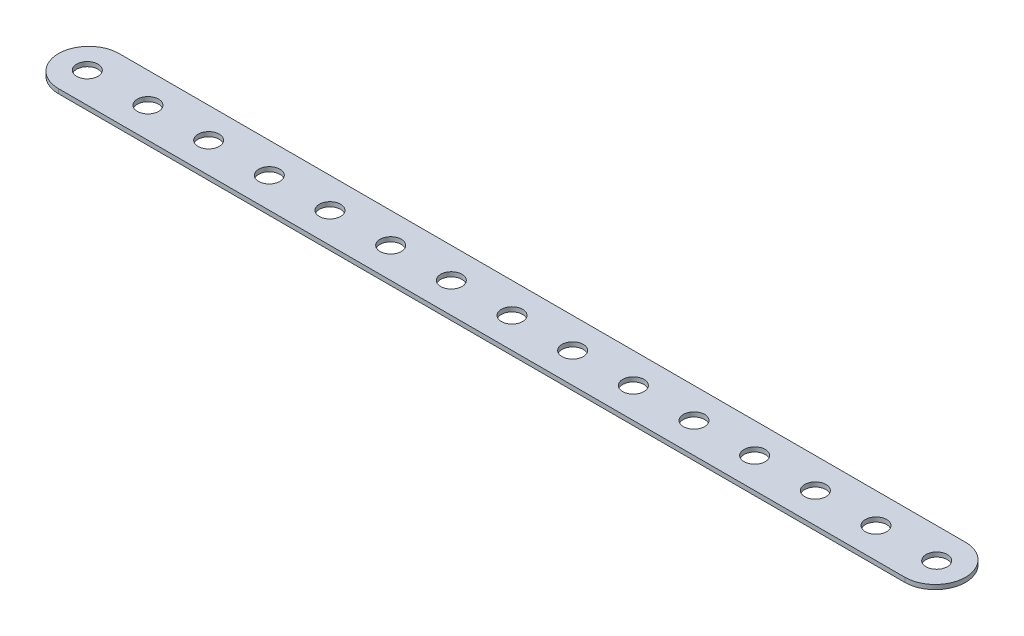
ISO-10303-21;
HEADER;
FILE_DESCRIPTION(('STEP AP214'),'2;1');
FILE_NAME('part.step','',(''),(''),'','','');
FILE_SCHEMA(('AUTOMOTIVE_DESIGN { 1 0 10303 214 1 1 1 1 }'));
ENDSEC;
DATA;
#1=APPLICATION_CONTEXT('core data for automotive mechanical design processes');
#2=APPLICATION_PROTOCOL_DEFINITION('international standard','automotive_design',2000,#1);
#3=PRODUCT_CONTEXT('',#1,'mechanical');
#4=PRODUCT('Part','Part','',(#3));
#5=PRODUCT_RELATED_PRODUCT_CATEGORY('part','',(#4));
#6=PRODUCT_DEFINITION_FORMATION('','',#4);
#7=PRODUCT_DEFINITION_CONTEXT('part definition',#1,'design');
#8=PRODUCT_DEFINITION('design','',#6,#7);
#9=PRODUCT_DEFINITION_SHAPE('','',#8);
#10=(LENGTH_UNIT() NAMED_UNIT(*) SI_UNIT(.MILLI.,.METRE.));
#11=(NAMED_UNIT(*) PLANE_ANGLE_UNIT() SI_UNIT($,.RADIAN.));
#12=(NAMED_UNIT(*) SI_UNIT($,.STERADIAN.) SOLID_ANGLE_UNIT());
#13=UNCERTAINTY_MEASURE_WITH_UNIT(LENGTH_MEASURE(1.E-05),#10,'distance_accuracy_value','');
#14=(GEOMETRIC_REPRESENTATION_CONTEXT(3) GLOBAL_UNCERTAINTY_ASSIGNED_CONTEXT((#13)) GLOBAL_UNIT_ASSIGNED_CONTEXT((#10,
#11,#12)) REPRESENTATION_CONTEXT('',''));
#15=CARTESIAN_POINT('',(0.,0.,0.));
#16=DIRECTION('',(0.,0.,1.));
#17=DIRECTION('',(1.,0.,0.));
#18=AXIS2_PLACEMENT_3D('',#15,#16,#17);
#19=CARTESIAN_POINT('',(0.,0.9398,6.35));
#20=DIRECTION('',(0.,0.,-1.));
#21=DIRECTION('',(-1.,0.,0.));
#22=AXIS2_PLACEMENT_3D('',#19,#20,#21);
#23=PLANE('',#22);
#24=DIRECTION('',(1.,0.,0.));
#25=VECTOR('',#24,1.);
#26=CARTESIAN_POINT('',(0.,0.,6.35));
#27=LINE('',#26,#25);
#28=CARTESIAN_POINT('',(-177.165,0.,6.35));
#29=VERTEX_POINT('',#28);
#30=CARTESIAN_POINT('',(0.,0.,6.35));
#31=VERTEX_POINT('',#30);
#32=EDGE_CURVE('E108',#29,#31,#27,.T.);
#33=ORIENTED_EDGE('',*,*,#32,.T.);
#34=DIRECTION('',(0.,-1.,0.));
#35=VECTOR('',#34,1.);
#36=CARTESIAN_POINT('',(0.,0.9398,6.35));
#37=LINE('',#36,#35);
#38=CARTESIAN_POINT('',(0.,0.9398,6.35));
#39=VERTEX_POINT('',#38);
#40=EDGE_CURVE('E92',#39,#31,#37,.T.);
#41=ORIENTED_EDGE('',*,*,#40,.F.);
#42=DIRECTION('',(1.,0.,0.));
#43=VECTOR('',#42,1.);
#44=CARTESIAN_POINT('',(0.,0.9398,6.35));
#45=LINE('',#44,#43);
#46=CARTESIAN_POINT('',(-177.165,0.9398,6.35));
#47=VERTEX_POINT('',#46);
#48=EDGE_CURVE('E86',#47,#39,#45,.T.);
#49=ORIENTED_EDGE('',*,*,#48,.F.);
#50=DIRECTION('',(0.,-1.,0.));
#51=VECTOR('',#50,1.);
#52=CARTESIAN_POINT('',(-177.165,0.9398,6.35));
#53=LINE('',#52,#51);
#54=EDGE_CURVE('E97',#47,#29,#53,.T.);
#55=ORIENTED_EDGE('',*,*,#54,.T.);
#56=EDGE_LOOP('',(#33,#41,#49,#55));
#57=FACE_BOUND('',#56,.T.);
#58=ADVANCED_FACE('F32',(#57),#23,.F.);
#59=CARTESIAN_POINT('',(0.,0.9398,0.));
#60=DIRECTION('',(0.,-1.,0.));
#61=DIRECTION('',(0.,0.,-1.));
#62=AXIS2_PLACEMENT_3D('',#59,#60,#61);
#63=CYLINDRICAL_SURFACE('',#62,6.35);
#64=CARTESIAN_POINT('',(0.,0.,0.));
#65=DIRECTION('',(0.,1.,0.));
#66=DIRECTION('',(0.,0.,1.));
#67=AXIS2_PLACEMENT_3D('',#64,#65,#66);
#68=CIRCLE('',#67,6.35);
#69=CARTESIAN_POINT('',(0.,0.,-6.35));
#70=VERTEX_POINT('',#69);
#71=EDGE_CURVE('E91',#31,#70,#68,.T.);
#72=ORIENTED_EDGE('',*,*,#71,.T.);
#73=DIRECTION('',(0.,-1.,0.));
#74=VECTOR('',#73,1.);
#75=CARTESIAN_POINT('',(0.,0.9398,-6.35));
#76=LINE('',#75,#74);
#77=CARTESIAN_POINT('',(0.,0.9398,-6.35));
#78=VERTEX_POINT('',#77);
#79=EDGE_CURVE('E89',#78,#70,#76,.T.);
#80=ORIENTED_EDGE('',*,*,#79,.F.);
#81=CARTESIAN_POINT('',(0.,0.9398,0.));
#82=DIRECTION('',(0.,1.,0.));
#83=DIRECTION('',(0.,0.,1.));
#84=AXIS2_PLACEMENT_3D('',#81,#82,#83);
#85=CIRCLE('',#84,6.35);
#86=EDGE_CURVE('E80',#39,#78,#85,.T.);
#87=ORIENTED_EDGE('',*,*,#86,.F.);
#88=ORIENTED_EDGE('',*,*,#40,.T.);
#89=EDGE_LOOP('',(#72,#80,#87,#88));
#90=FACE_BOUND('',#89,.T.);
#91=ADVANCED_FACE('F90',(#90),#63,.T.);
#92=CARTESIAN_POINT('',(0.,0.9398,-6.35));
#93=DIRECTION('',(0.,0.,1.));
#94=DIRECTION('',(1.,0.,0.));
#95=AXIS2_PLACEMENT_3D('',#92,#93,#94);
#96=PLANE('',#95);
#97=DIRECTION('',(-1.,0.,0.));
#98=VECTOR('',#97,1.);
#99=CARTESIAN_POINT('',(0.,0.,-6.35));
#100=LINE('',#99,#98);
#101=CARTESIAN_POINT('',(-177.165,0.,-6.35));
#102=VERTEX_POINT('',#101);
#103=EDGE_CURVE('E66',#70,#102,#100,.T.);
#104=ORIENTED_EDGE('',*,*,#103,.T.);
#105=DIRECTION('',(0.,-1.,0.));
#106=VECTOR('',#105,1.);
#107=CARTESIAN_POINT('',(-177.165,0.9398,-6.35));
#108=LINE('',#107,#106);
#109=CARTESIAN_POINT('',(-177.165,0.9398,-6.35));
#110=VERTEX_POINT('',#109);
#111=EDGE_CURVE('E93',#110,#102,#108,.T.);
#112=ORIENTED_EDGE('',*,*,#111,.F.);
#113=DIRECTION('',(-1.,0.,0.));
#114=VECTOR('',#113,1.);
#115=CARTESIAN_POINT('',(0.,0.9398,-6.35));
#116=LINE('',#115,#114);
#117=EDGE_CURVE('E84',#78,#110,#116,.T.);
#118=ORIENTED_EDGE('',*,*,#117,.F.);
#119=ORIENTED_EDGE('',*,*,#79,.T.);
#120=EDGE_LOOP('',(#104,#112,#118,#119));
#121=FACE_BOUND('',#120,.T.);
#122=ADVANCED_FACE('F95',(#121),#96,.F.);
#123=CARTESIAN_POINT('',(0.317500000000001,0.9398,0.));
#124=DIRECTION('',(0.,-1.,0.));
#125=DIRECTION('',(0.,0.,-1.));
#126=AXIS2_PLACEMENT_3D('',#123,#124,#125);
#127=CYLINDRICAL_SURFACE('',#126,2.2225);
#128=CARTESIAN_POINT('',(0.317500000000001,0.9398,0.));
#129=DIRECTION('',(0.,1.,0.));
#130=DIRECTION('',(0.,0.,1.));
#131=AXIS2_PLACEMENT_3D('',#128,#129,#130);
#132=CIRCLE('',#131,2.2225);
#133=CARTESIAN_POINT('',(0.317500000000001,0.9398,2.2225));
#134=VERTEX_POINT('',#133);
#135=EDGE_CURVE('E405',#134,#134,#132,.T.);
#136=ORIENTED_EDGE('',*,*,#135,.T.);
#137=EDGE_LOOP('',(#136));
#138=FACE_BOUND('',#137,.T.);
#139=CARTESIAN_POINT('',(0.317500000000001,0.,0.));
#140=DIRECTION('',(0.,1.,0.));
#141=DIRECTION('',(0.,0.,1.));
#142=AXIS2_PLACEMENT_3D('',#139,#140,#141);
#143=CIRCLE('',#142,2.2225);
#144=CARTESIAN_POINT('',(0.317500000000001,0.,2.2225));
#145=VERTEX_POINT('',#144);
#146=EDGE_CURVE('E104',#145,#145,#143,.T.);
#147=ORIENTED_EDGE('',*,*,#146,.F.);
#148=EDGE_LOOP('',(#147));
#149=FACE_BOUND('',#148,.T.);
#150=ADVANCED_FACE('F212',(#138,#149),#127,.F.);
#151=CARTESIAN_POINT('',(-177.4825,0.9398,0.));
#152=DIRECTION('',(0.,-1.,0.));
#153=DIRECTION('',(0.,0.,-1.));
#154=AXIS2_PLACEMENT_3D('',#151,#152,#153);
#155=CYLINDRICAL_SURFACE('',#154,2.22249999999999);
#156=CARTESIAN_POINT('',(-177.4825,0.9398,0.));
#157=DIRECTION('',(0.,1.,0.));
#158=DIRECTION('',(0.,0.,1.));
#159=AXIS2_PLACEMENT_3D('',#156,#157,#158);
#160=CIRCLE('',#159,2.22249999999999);
#161=CARTESIAN_POINT('',(-177.4825,0.9398,2.22249999999999));
#162=VERTEX_POINT('',#161);
#163=EDGE_CURVE('E114',#162,#162,#160,.T.);
#164=ORIENTED_EDGE('',*,*,#163,.T.);
#165=EDGE_LOOP('',(#164));
#166=FACE_BOUND('',#165,.T.);
#167=CARTESIAN_POINT('',(-177.4825,0.,0.));
#168=DIRECTION('',(0.,1.,0.));
#169=DIRECTION('',(0.,0.,1.));
#170=AXIS2_PLACEMENT_3D('',#167,#168,#169);
#171=CIRCLE('',#170,2.22249999999999);
#172=CARTESIAN_POINT('',(-177.4825,0.,2.22249999999999));
#173=VERTEX_POINT('',#172);
#174=EDGE_CURVE('E101',#173,#173,#171,.T.);
#175=ORIENTED_EDGE('',*,*,#174,.F.);
#176=EDGE_LOOP('',(#175));
#177=FACE_BOUND('',#176,.T.);
#178=ADVANCED_FACE('F198',(#166,#177),#155,.F.);
#179=CARTESIAN_POINT('',(-177.165,0.9398,0.));
#180=DIRECTION('',(0.,-1.,0.));
#181=DIRECTION('',(0.,0.,-1.));
#182=AXIS2_PLACEMENT_3D('',#179,#180,#181);
#183=CYLINDRICAL_SURFACE('',#182,6.35);
#184=CARTESIAN_POINT('',(-177.165,0.,0.));
#185=DIRECTION('',(0.,1.,0.));
#186=DIRECTION('',(0.,0.,1.));
#187=AXIS2_PLACEMENT_3D('',#184,#185,#186);
#188=CIRCLE('',#187,6.35);
#189=EDGE_CURVE('E72',#102,#29,#188,.T.);
#190=ORIENTED_EDGE('',*,*,#189,.T.);
#191=ORIENTED_EDGE('',*,*,#54,.F.);
#192=CARTESIAN_POINT('',(-177.165,0.9398,0.));
#193=DIRECTION('',(0.,1.,0.));
#194=DIRECTION('',(0.,0.,1.));
#195=AXIS2_PLACEMENT_3D('',#192,#193,#194);
#196=CIRCLE('',#195,6.35);
#197=EDGE_CURVE('E49',#110,#47,#196,.T.);
#198=ORIENTED_EDGE('',*,*,#197,.F.);
#199=ORIENTED_EDGE('',*,*,#111,.T.);
#200=EDGE_LOOP('',(#190,#191,#198,#199));
#201=FACE_BOUND('',#200,.T.);
#202=ADVANCED_FACE('F188',(#201),#183,.T.);
#203=CARTESIAN_POINT('',(0.,0.9398,0.));
#204=DIRECTION('',(0.,1.,0.));
#205=DIRECTION('',(0.,0.,1.));
#206=AXIS2_PLACEMENT_3D('',#203,#204,#205);
#207=PLANE('',#206);
#208=CARTESIAN_POINT('',(-152.0825,0.9398,0.));
#209=DIRECTION('',(0.,1.,0.));
#210=DIRECTION('',(0.,0.,1.));
#211=AXIS2_PLACEMENT_3D('',#208,#209,#210);
#212=CIRCLE('',#211,2.22249999999999);
#213=CARTESIAN_POINT('',(-152.0825,0.9398,2.22249999999999));
#214=VERTEX_POINT('',#213);
#215=EDGE_CURVE('E396',#214,#214,#212,.T.);
#216=ORIENTED_EDGE('',*,*,#215,.F.);
#217=EDGE_LOOP('',(#216));
#218=FACE_BOUND('',#217,.T.);
#219=CARTESIAN_POINT('',(-164.7825,0.9398,0.));
#220=DIRECTION('',(0.,1.,0.));
#221=DIRECTION('',(0.,0.,1.));
#222=AXIS2_PLACEMENT_3D('',#219,#220,#221);
#223=CIRCLE('',#222,2.22249999999999);
#224=CARTESIAN_POINT('',(-164.7825,0.9398,2.22249999999999));
#225=VERTEX_POINT('',#224);
#226=EDGE_CURVE('E395',#225,#225,#223,.T.);
#227=ORIENTED_EDGE('',*,*,#226,.F.);
#228=EDGE_LOOP('',(#227));
#229=FACE_BOUND('',#228,.T.);
#230=ORIENTED_EDGE('',*,*,#163,.F.);
#231=EDGE_LOOP('',(#230));
#232=FACE_BOUND('',#231,.T.);
#233=ORIENTED_EDGE('',*,*,#135,.F.);
#234=EDGE_LOOP('',(#233));
#235=FACE_BOUND('',#234,.T.);
#236=ORIENTED_EDGE('',*,*,#48,.T.);
#237=ORIENTED_EDGE('',*,*,#86,.T.);
#238=ORIENTED_EDGE('',*,*,#117,.T.);
#239=ORIENTED_EDGE('',*,*,#197,.T.);
#240=EDGE_LOOP('',(#236,#237,#238,#239));
#241=FACE_BOUND('',#240,.T.);
#242=CARTESIAN_POINT('',(-139.3825,0.9398,0.));
#243=DIRECTION('',(0.,1.,0.));
#244=DIRECTION('',(0.,0.,1.));
#245=AXIS2_PLACEMENT_3D('',#242,#243,#244);
#246=CIRCLE('',#245,2.22249999999999);
#247=CARTESIAN_POINT('',(-139.3825,0.9398,2.22249999999999));
#248=VERTEX_POINT('',#247);
#249=EDGE_CURVE('E121',#248,#248,#246,.T.);
#250=ORIENTED_EDGE('',*,*,#249,.F.);
#251=EDGE_LOOP('',(#250));
#252=FACE_BOUND('',#251,.T.);
#253=CARTESIAN_POINT('',(-126.6825,0.9398,0.));
#254=DIRECTION('',(0.,1.,0.));
#255=DIRECTION('',(0.,0.,1.));
#256=AXIS2_PLACEMENT_3D('',#253,#254,#255);
#257=CIRCLE('',#256,2.22249999999999);
#258=CARTESIAN_POINT('',(-126.6825,0.9398,2.22249999999999));
#259=VERTEX_POINT('',#258);
#260=EDGE_CURVE('E127',#259,#259,#257,.T.);
#261=ORIENTED_EDGE('',*,*,#260,.F.);
#262=EDGE_LOOP('',(#261));
#263=FACE_BOUND('',#262,.T.);
#264=CARTESIAN_POINT('',(-113.9825,0.9398,0.));
#265=DIRECTION('',(0.,1.,0.));
#266=DIRECTION('',(0.,0.,1.));
#267=AXIS2_PLACEMENT_3D('',#264,#265,#266);
#268=CIRCLE('',#267,2.22249999999999);
#269=CARTESIAN_POINT('',(-113.9825,0.9398,2.22249999999999));
#270=VERTEX_POINT('',#269);
#271=EDGE_CURVE('E133',#270,#270,#268,.T.);
#272=ORIENTED_EDGE('',*,*,#271,.F.);
#273=EDGE_LOOP('',(#272));
#274=FACE_BOUND('',#273,.T.);
#275=CARTESIAN_POINT('',(-101.2825,0.9398,0.));
#276=DIRECTION('',(0.,1.,0.));
#277=DIRECTION('',(0.,0.,1.));
#278=AXIS2_PLACEMENT_3D('',#275,#276,#277);
#279=CIRCLE('',#278,2.22249999999999);
#280=CARTESIAN_POINT('',(-101.2825,0.9398,2.22249999999999));
#281=VERTEX_POINT('',#280);
#282=EDGE_CURVE('E139',#281,#281,#279,.T.);
#283=ORIENTED_EDGE('',*,*,#282,.F.);
#284=EDGE_LOOP('',(#283));
#285=FACE_BOUND('',#284,.T.);
#286=CARTESIAN_POINT('',(-88.5825,0.9398,0.));
#287=DIRECTION('',(0.,1.,0.));
#288=DIRECTION('',(0.,0.,1.));
#289=AXIS2_PLACEMENT_3D('',#286,#287,#288);
#290=CIRCLE('',#289,2.22249999999999);
#291=CARTESIAN_POINT('',(-88.5825,0.9398,2.22249999999999));
#292=VERTEX_POINT('',#291);
#293=EDGE_CURVE('E145',#292,#292,#290,.T.);
#294=ORIENTED_EDGE('',*,*,#293,.F.);
#295=EDGE_LOOP('',(#294));
#296=FACE_BOUND('',#295,.T.);
#297=CARTESIAN_POINT('',(-75.8825,0.9398,0.));
#298=DIRECTION('',(0.,1.,0.));
#299=DIRECTION('',(0.,0.,1.));
#300=AXIS2_PLACEMENT_3D('',#297,#298,#299);
#301=CIRCLE('',#300,2.22249999999999);
#302=CARTESIAN_POINT('',(-75.8825,0.9398,2.22249999999999));
#303=VERTEX_POINT('',#302);
#304=EDGE_CURVE('E151',#303,#303,#301,.T.);
#305=ORIENTED_EDGE('',*,*,#304,.F.);
#306=EDGE_LOOP('',(#305));
#307=FACE_BOUND('',#306,.T.);
#308=CARTESIAN_POINT('',(-63.1825,0.9398,0.));
#309=DIRECTION('',(0.,1.,0.));
#310=DIRECTION('',(0.,0.,1.));
#311=AXIS2_PLACEMENT_3D('',#308,#309,#310);
#312=CIRCLE('',#311,2.22249999999999);
#313=CARTESIAN_POINT('',(-63.1825,0.9398,2.22249999999999));
#314=VERTEX_POINT('',#313);
#315=EDGE_CURVE('E157',#314,#314,#312,.T.);
#316=ORIENTED_EDGE('',*,*,#315,.F.);
#317=EDGE_LOOP('',(#316));
#318=FACE_BOUND('',#317,.T.);
#319=CARTESIAN_POINT('',(-50.4825,0.9398,0.));
#320=DIRECTION('',(0.,1.,0.));
#321=DIRECTION('',(0.,0.,1.));
#322=AXIS2_PLACEMENT_3D('',#319,#320,#321);
#323=CIRCLE('',#322,2.22249999999999);
#324=CARTESIAN_POINT('',(-50.4825,0.9398,2.22249999999999));
#325=VERTEX_POINT('',#324);
#326=EDGE_CURVE('E163',#325,#325,#323,.T.);
#327=ORIENTED_EDGE('',*,*,#326,.F.);
#328=EDGE_LOOP('',(#327));
#329=FACE_BOUND('',#328,.T.);
#330=CARTESIAN_POINT('',(-37.7825,0.9398,0.));
#331=DIRECTION('',(0.,1.,0.));
#332=DIRECTION('',(0.,0.,1.));
#333=AXIS2_PLACEMENT_3D('',#330,#331,#332);
#334=CIRCLE('',#333,2.22249999999999);
#335=CARTESIAN_POINT('',(-37.7825,0.9398,2.22249999999999));
#336=VERTEX_POINT('',#335);
#337=EDGE_CURVE('E169',#336,#336,#334,.T.);
#338=ORIENTED_EDGE('',*,*,#337,.F.);
#339=EDGE_LOOP('',(#338));
#340=FACE_BOUND('',#339,.T.);
#341=CARTESIAN_POINT('',(-25.0825,0.9398,0.));
#342=DIRECTION('',(0.,1.,0.));
#343=DIRECTION('',(0.,0.,1.));
#344=AXIS2_PLACEMENT_3D('',#341,#342,#343);
#345=CIRCLE('',#344,2.22249999999999);
#346=CARTESIAN_POINT('',(-25.0825,0.9398,2.22249999999999));
#347=VERTEX_POINT('',#346);
#348=EDGE_CURVE('E175',#347,#347,#345,.T.);
#349=ORIENTED_EDGE('',*,*,#348,.F.);
#350=EDGE_LOOP('',(#349));
#351=FACE_BOUND('',#350,.T.);
#352=CARTESIAN_POINT('',(-12.3825,0.9398,0.));
#353=DIRECTION('',(0.,1.,0.));
#354=DIRECTION('',(0.,0.,1.));
#355=AXIS2_PLACEMENT_3D('',#352,#353,#354);
#356=CIRCLE('',#355,2.22249999999999);
#357=CARTESIAN_POINT('',(-12.3825,0.9398,2.22249999999999));
#358=VERTEX_POINT('',#357);
#359=EDGE_CURVE('E11',#358,#358,#356,.T.);
#360=ORIENTED_EDGE('',*,*,#359,.F.);
#361=EDGE_LOOP('',(#360));
#362=FACE_BOUND('',#361,.T.);
#363=ADVANCED_FACE('F81',(#218,#229,#232,#235,#241,#252,#263,#274,#285,#296,#307,#318,#329,#340,
#351,#362),#207,.T.);
#364=CARTESIAN_POINT('',(0.,0.,0.));
#365=DIRECTION('',(0.,1.,0.));
#366=DIRECTION('',(0.,0.,1.));
#367=AXIS2_PLACEMENT_3D('',#364,#365,#366);
#368=PLANE('',#367);
#369=CARTESIAN_POINT('',(-152.0825,0.,0.));
#370=DIRECTION('',(0.,1.,0.));
#371=DIRECTION('',(0.,0.,1.));
#372=AXIS2_PLACEMENT_3D('',#369,#370,#371);
#373=CIRCLE('',#372,2.22249999999999);
#374=CARTESIAN_POINT('',(-152.0825,0.,2.22249999999999));
#375=VERTEX_POINT('',#374);
#376=EDGE_CURVE('E400',#375,#375,#373,.T.);
#377=ORIENTED_EDGE('',*,*,#376,.T.);
#378=EDGE_LOOP('',(#377));
#379=FACE_BOUND('',#378,.T.);
#380=CARTESIAN_POINT('',(-164.7825,0.,0.));
#381=DIRECTION('',(0.,1.,0.));
#382=DIRECTION('',(0.,0.,1.));
#383=AXIS2_PLACEMENT_3D('',#380,#381,#382);
#384=CIRCLE('',#383,2.22249999999999);
#385=CARTESIAN_POINT('',(-164.7825,0.,2.22249999999999));
#386=VERTEX_POINT('',#385);
#387=EDGE_CURVE('E105',#386,#386,#384,.T.);
#388=ORIENTED_EDGE('',*,*,#387,.T.);
#389=EDGE_LOOP('',(#388));
#390=FACE_BOUND('',#389,.T.);
#391=ORIENTED_EDGE('',*,*,#174,.T.);
#392=EDGE_LOOP('',(#391));
#393=FACE_BOUND('',#392,.T.);
#394=ORIENTED_EDGE('',*,*,#146,.T.);
#395=EDGE_LOOP('',(#394));
#396=FACE_BOUND('',#395,.T.);
#397=ORIENTED_EDGE('',*,*,#32,.F.);
#398=ORIENTED_EDGE('',*,*,#189,.F.);
#399=ORIENTED_EDGE('',*,*,#103,.F.);
#400=ORIENTED_EDGE('',*,*,#71,.F.);
#401=EDGE_LOOP('',(#397,#398,#399,#400));
#402=FACE_BOUND('',#401,.T.);
#403=CARTESIAN_POINT('',(-139.3825,0.,0.));
#404=DIRECTION('',(0.,1.,0.));
#405=DIRECTION('',(0.,0.,1.));
#406=AXIS2_PLACEMENT_3D('',#403,#404,#405);
#407=CIRCLE('',#406,2.22249999999999);
#408=CARTESIAN_POINT('',(-139.3825,0.,2.22249999999999));
#409=VERTEX_POINT('',#408);
#410=EDGE_CURVE('E118',#409,#409,#407,.T.);
#411=ORIENTED_EDGE('',*,*,#410,.T.);
#412=EDGE_LOOP('',(#411));
#413=FACE_BOUND('',#412,.T.);
#414=CARTESIAN_POINT('',(-126.6825,0.,0.));
#415=DIRECTION('',(0.,1.,0.));
#416=DIRECTION('',(0.,0.,1.));
#417=AXIS2_PLACEMENT_3D('',#414,#415,#416);
#418=CIRCLE('',#417,2.22249999999999);
#419=CARTESIAN_POINT('',(-126.6825,0.,2.22249999999999));
#420=VERTEX_POINT('',#419);
#421=EDGE_CURVE('E124',#420,#420,#418,.T.);
#422=ORIENTED_EDGE('',*,*,#421,.T.);
#423=EDGE_LOOP('',(#422));
#424=FACE_BOUND('',#423,.T.);
#425=CARTESIAN_POINT('',(-113.9825,0.,0.));
#426=DIRECTION('',(0.,1.,0.));
#427=DIRECTION('',(0.,0.,1.));
#428=AXIS2_PLACEMENT_3D('',#425,#426,#427);
#429=CIRCLE('',#428,2.22249999999999);
#430=CARTESIAN_POINT('',(-113.9825,0.,2.22249999999999));
#431=VERTEX_POINT('',#430);
#432=EDGE_CURVE('E130',#431,#431,#429,.T.);
#433=ORIENTED_EDGE('',*,*,#432,.T.);
#434=EDGE_LOOP('',(#433));
#435=FACE_BOUND('',#434,.T.);
#436=CARTESIAN_POINT('',(-101.2825,0.,0.));
#437=DIRECTION('',(0.,1.,0.));
#438=DIRECTION('',(0.,0.,1.));
#439=AXIS2_PLACEMENT_3D('',#436,#437,#438);
#440=CIRCLE('',#439,2.22249999999999);
#441=CARTESIAN_POINT('',(-101.2825,0.,2.22249999999999));
#442=VERTEX_POINT('',#441);
#443=EDGE_CURVE('E136',#442,#442,#440,.T.);
#444=ORIENTED_EDGE('',*,*,#443,.T.);
#445=EDGE_LOOP('',(#444));
#446=FACE_BOUND('',#445,.T.);
#447=CARTESIAN_POINT('',(-88.5825,0.,0.));
#448=DIRECTION('',(0.,1.,0.));
#449=DIRECTION('',(0.,0.,1.));
#450=AXIS2_PLACEMENT_3D('',#447,#448,#449);
#451=CIRCLE('',#450,2.22249999999999);
#452=CARTESIAN_POINT('',(-88.5825,0.,2.22249999999999));
#453=VERTEX_POINT('',#452);
#454=EDGE_CURVE('E142',#453,#453,#451,.T.);
#455=ORIENTED_EDGE('',*,*,#454,.T.);
#456=EDGE_LOOP('',(#455));
#457=FACE_BOUND('',#456,.T.);
#458=CARTESIAN_POINT('',(-75.8825,0.,0.));
#459=DIRECTION('',(0.,1.,0.));
#460=DIRECTION('',(0.,0.,1.));
#461=AXIS2_PLACEMENT_3D('',#458,#459,#460);
#462=CIRCLE('',#461,2.22249999999999);
#463=CARTESIAN_POINT('',(-75.8825,0.,2.22249999999999));
#464=VERTEX_POINT('',#463);
#465=EDGE_CURVE('E148',#464,#464,#462,.T.);
#466=ORIENTED_EDGE('',*,*,#465,.T.);
#467=EDGE_LOOP('',(#466));
#468=FACE_BOUND('',#467,.T.);
#469=CARTESIAN_POINT('',(-63.1825,0.,0.));
#470=DIRECTION('',(0.,1.,0.));
#471=DIRECTION('',(0.,0.,1.));
#472=AXIS2_PLACEMENT_3D('',#469,#470,#471);
#473=CIRCLE('',#472,2.22249999999999);
#474=CARTESIAN_POINT('',(-63.1825,0.,2.22249999999999));
#475=VERTEX_POINT('',#474);
#476=EDGE_CURVE('E154',#475,#475,#473,.T.);
#477=ORIENTED_EDGE('',*,*,#476,.T.);
#478=EDGE_LOOP('',(#477));
#479=FACE_BOUND('',#478,.T.);
#480=CARTESIAN_POINT('',(-50.4825,0.,0.));
#481=DIRECTION('',(0.,1.,0.));
#482=DIRECTION('',(0.,0.,1.));
#483=AXIS2_PLACEMENT_3D('',#480,#481,#482);
#484=CIRCLE('',#483,2.22249999999999);
#485=CARTESIAN_POINT('',(-50.4825,0.,2.22249999999999));
#486=VERTEX_POINT('',#485);
#487=EDGE_CURVE('E160',#486,#486,#484,.T.);
#488=ORIENTED_EDGE('',*,*,#487,.T.);
#489=EDGE_LOOP('',(#488));
#490=FACE_BOUND('',#489,.T.);
#491=CARTESIAN_POINT('',(-37.7825,0.,0.));
#492=DIRECTION('',(0.,1.,0.));
#493=DIRECTION('',(0.,0.,1.));
#494=AXIS2_PLACEMENT_3D('',#491,#492,#493);
#495=CIRCLE('',#494,2.22249999999999);
#496=CARTESIAN_POINT('',(-37.7825,0.,2.22249999999999));
#497=VERTEX_POINT('',#496);
#498=EDGE_CURVE('E166',#497,#497,#495,.T.);
#499=ORIENTED_EDGE('',*,*,#498,.T.);
#500=EDGE_LOOP('',(#499));
#501=FACE_BOUND('',#500,.T.);
#502=CARTESIAN_POINT('',(-25.0825,0.,0.));
#503=DIRECTION('',(0.,1.,0.));
#504=DIRECTION('',(0.,0.,1.));
#505=AXIS2_PLACEMENT_3D('',#502,#503,#504);
#506=CIRCLE('',#505,2.22249999999999);
#507=CARTESIAN_POINT('',(-25.0825,0.,2.22249999999999));
#508=VERTEX_POINT('',#507);
#509=EDGE_CURVE('E172',#508,#508,#506,.T.);
#510=ORIENTED_EDGE('',*,*,#509,.T.);
#511=EDGE_LOOP('',(#510));
#512=FACE_BOUND('',#511,.T.);
#513=CARTESIAN_POINT('',(-12.3825,0.,0.));
#514=DIRECTION('',(0.,1.,0.));
#515=DIRECTION('',(0.,0.,1.));
#516=AXIS2_PLACEMENT_3D('',#513,#514,#515);
#517=CIRCLE('',#516,2.22249999999999);
#518=CARTESIAN_POINT('',(-12.3825,0.,2.22249999999999));
#519=VERTEX_POINT('',#518);
#520=EDGE_CURVE('E41',#519,#519,#517,.T.);
#521=ORIENTED_EDGE('',*,*,#520,.T.);
#522=EDGE_LOOP('',(#521));
#523=FACE_BOUND('',#522,.T.);
#524=ADVANCED_FACE('F180',(#379,#390,#393,#396,#402,#413,#424,#435,#446,#457,#468,#479,#490,
#501,#512,#523),#368,.F.);
#525=CARTESIAN_POINT('',(-164.7825,0.,0.));
#526=DIRECTION('',(0.,1.,0.));
#527=DIRECTION('',(0.,0.,1.));
#528=AXIS2_PLACEMENT_3D('',#525,#526,#527);
#529=CYLINDRICAL_SURFACE('',#528,2.22249999999999);
#530=ORIENTED_EDGE('',*,*,#387,.F.);
#531=EDGE_LOOP('',(#530));
#532=FACE_BOUND('',#531,.T.);
#533=ORIENTED_EDGE('',*,*,#226,.T.);
#534=EDGE_LOOP('',(#533));
#535=FACE_BOUND('',#534,.T.);
#536=ADVANCED_FACE('F195',(#532,#535),#529,.F.);
#537=CARTESIAN_POINT('',(-152.0825,0.,0.));
#538=DIRECTION('',(0.,1.,0.));
#539=DIRECTION('',(0.,0.,1.));
#540=AXIS2_PLACEMENT_3D('',#537,#538,#539);
#541=CYLINDRICAL_SURFACE('',#540,2.22249999999999);
#542=ORIENTED_EDGE('',*,*,#376,.F.);
#543=EDGE_LOOP('',(#542));
#544=FACE_BOUND('',#543,.T.);
#545=ORIENTED_EDGE('',*,*,#215,.T.);
#546=EDGE_LOOP('',(#545));
#547=FACE_BOUND('',#546,.T.);
#548=ADVANCED_FACE('F223',(#544,#547),#541,.F.);
#549=CARTESIAN_POINT('',(-139.3825,0.,0.));
#550=DIRECTION('',(0.,1.,0.));
#551=DIRECTION('',(0.,0.,1.));
#552=AXIS2_PLACEMENT_3D('',#549,#550,#551);
#553=CYLINDRICAL_SURFACE('',#552,2.22249999999999);
#554=ORIENTED_EDGE('',*,*,#410,.F.);
#555=EDGE_LOOP('',(#554));
#556=FACE_BOUND('',#555,.T.);
#557=ORIENTED_EDGE('',*,*,#249,.T.);
#558=EDGE_LOOP('',(#557));
#559=FACE_BOUND('',#558,.T.);
#560=ADVANCED_FACE('F219',(#556,#559),#553,.F.);
#561=CARTESIAN_POINT('',(-126.6825,0.,0.));
#562=DIRECTION('',(0.,1.,0.));
#563=DIRECTION('',(0.,0.,1.));
#564=AXIS2_PLACEMENT_3D('',#561,#562,#563);
#565=CYLINDRICAL_SURFACE('',#564,2.22249999999999);
#566=ORIENTED_EDGE('',*,*,#421,.F.);
#567=EDGE_LOOP('',(#566));
#568=FACE_BOUND('',#567,.T.);
#569=ORIENTED_EDGE('',*,*,#260,.T.);
#570=EDGE_LOOP('',(#569));
#571=FACE_BOUND('',#570,.T.);
#572=ADVANCED_FACE('F222',(#568,#571),#565,.F.);
#573=CARTESIAN_POINT('',(-113.9825,0.,0.));
#574=DIRECTION('',(0.,1.,0.));
#575=DIRECTION('',(0.,0.,1.));
#576=AXIS2_PLACEMENT_3D('',#573,#574,#575);
#577=CYLINDRICAL_SURFACE('',#576,2.22249999999999);
#578=ORIENTED_EDGE('',*,*,#432,.F.);
#579=EDGE_LOOP('',(#578));
#580=FACE_BOUND('',#579,.T.);
#581=ORIENTED_EDGE('',*,*,#271,.T.);
#582=EDGE_LOOP('',(#581));
#583=FACE_BOUND('',#582,.T.);
#584=ADVANCED_FACE('F227',(#580,#583),#577,.F.);
#585=CARTESIAN_POINT('',(-101.2825,0.,0.));
#586=DIRECTION('',(0.,1.,0.));
#587=DIRECTION('',(0.,0.,1.));
#588=AXIS2_PLACEMENT_3D('',#585,#586,#587);
#589=CYLINDRICAL_SURFACE('',#588,2.22249999999999);
#590=ORIENTED_EDGE('',*,*,#443,.F.);
#591=EDGE_LOOP('',(#590));
#592=FACE_BOUND('',#591,.T.);
#593=ORIENTED_EDGE('',*,*,#282,.T.);
#594=EDGE_LOOP('',(#593));
#595=FACE_BOUND('',#594,.T.);
#596=ADVANCED_FACE('F231',(#592,#595),#589,.F.);
#597=CARTESIAN_POINT('',(-88.5825,0.,0.));
#598=DIRECTION('',(0.,1.,0.));
#599=DIRECTION('',(0.,0.,1.));
#600=AXIS2_PLACEMENT_3D('',#597,#598,#599);
#601=CYLINDRICAL_SURFACE('',#600,2.22249999999999);
#602=ORIENTED_EDGE('',*,*,#454,.F.);
#603=EDGE_LOOP('',(#602));
#604=FACE_BOUND('',#603,.T.);
#605=ORIENTED_EDGE('',*,*,#293,.T.);
#606=EDGE_LOOP('',(#605));
#607=FACE_BOUND('',#606,.T.);
#608=ADVANCED_FACE('F235',(#604,#607),#601,.F.);
#609=CARTESIAN_POINT('',(-75.8825,0.,0.));
#610=DIRECTION('',(0.,1.,0.));
#611=DIRECTION('',(0.,0.,1.));
#612=AXIS2_PLACEMENT_3D('',#609,#610,#611);
#613=CYLINDRICAL_SURFACE('',#612,2.22249999999999);
#614=ORIENTED_EDGE('',*,*,#465,.F.);
#615=EDGE_LOOP('',(#614));
#616=FACE_BOUND('',#615,.T.);
#617=ORIENTED_EDGE('',*,*,#304,.T.);
#618=EDGE_LOOP('',(#617));
#619=FACE_BOUND('',#618,.T.);
#620=ADVANCED_FACE('F239',(#616,#619),#613,.F.);
#621=CARTESIAN_POINT('',(-63.1825,0.,0.));
#622=DIRECTION('',(0.,1.,0.));
#623=DIRECTION('',(0.,0.,1.));
#624=AXIS2_PLACEMENT_3D('',#621,#622,#623);
#625=CYLINDRICAL_SURFACE('',#624,2.22249999999999);
#626=ORIENTED_EDGE('',*,*,#476,.F.);
#627=EDGE_LOOP('',(#626));
#628=FACE_BOUND('',#627,.T.);
#629=ORIENTED_EDGE('',*,*,#315,.T.);
#630=EDGE_LOOP('',(#629));
#631=FACE_BOUND('',#630,.T.);
#632=ADVANCED_FACE('F243',(#628,#631),#625,.F.);
#633=CARTESIAN_POINT('',(-50.4825,0.,0.));
#634=DIRECTION('',(0.,1.,0.));
#635=DIRECTION('',(0.,0.,1.));
#636=AXIS2_PLACEMENT_3D('',#633,#634,#635);
#637=CYLINDRICAL_SURFACE('',#636,2.22249999999999);
#638=ORIENTED_EDGE('',*,*,#487,.F.);
#639=EDGE_LOOP('',(#638));
#640=FACE_BOUND('',#639,.T.);
#641=ORIENTED_EDGE('',*,*,#326,.T.);
#642=EDGE_LOOP('',(#641));
#643=FACE_BOUND('',#642,.T.);
#644=ADVANCED_FACE('F247',(#640,#643),#637,.F.);
#645=CARTESIAN_POINT('',(-37.7825,0.,0.));
#646=DIRECTION('',(0.,1.,0.));
#647=DIRECTION('',(0.,0.,1.));
#648=AXIS2_PLACEMENT_3D('',#645,#646,#647);
#649=CYLINDRICAL_SURFACE('',#648,2.22249999999999);
#650=ORIENTED_EDGE('',*,*,#498,.F.);
#651=EDGE_LOOP('',(#650));
#652=FACE_BOUND('',#651,.T.);
#653=ORIENTED_EDGE('',*,*,#337,.T.);
#654=EDGE_LOOP('',(#653));
#655=FACE_BOUND('',#654,.T.);
#656=ADVANCED_FACE('F251',(#652,#655),#649,.F.);
#657=CARTESIAN_POINT('',(-25.0825,0.,0.));
#658=DIRECTION('',(0.,1.,0.));
#659=DIRECTION('',(0.,0.,1.));
#660=AXIS2_PLACEMENT_3D('',#657,#658,#659);
#661=CYLINDRICAL_SURFACE('',#660,2.22249999999999);
#662=ORIENTED_EDGE('',*,*,#509,.F.);
#663=EDGE_LOOP('',(#662));
#664=FACE_BOUND('',#663,.T.);
#665=ORIENTED_EDGE('',*,*,#348,.T.);
#666=EDGE_LOOP('',(#665));
#667=FACE_BOUND('',#666,.T.);
#668=ADVANCED_FACE('F184',(#664,#667),#661,.F.);
#669=CARTESIAN_POINT('',(-12.3825,0.,0.));
#670=DIRECTION('',(0.,1.,0.));
#671=DIRECTION('',(0.,0.,1.));
#672=AXIS2_PLACEMENT_3D('',#669,#670,#671);
#673=CYLINDRICAL_SURFACE('',#672,2.22249999999999);
#674=ORIENTED_EDGE('',*,*,#520,.F.);
#675=EDGE_LOOP('',(#674));
#676=FACE_BOUND('',#675,.T.);
#677=ORIENTED_EDGE('',*,*,#359,.T.);
#678=EDGE_LOOP('',(#677));
#679=FACE_BOUND('',#678,.T.);
#680=ADVANCED_FACE('F34',(#676,#679),#673,.F.);
#681=CLOSED_SHELL('',(#58,#91,#122,#150,#178,#202,#363,#524,#536,#548,#560,#572,#584,#596,#608,
#620,#632,#644,#656,#668,#680));
#682=MANIFOLD_SOLID_BREP('B2',#681);
#683=ADVANCED_BREP_SHAPE_REPRESENTATION('',(#18,#682),#14);
#684=SHAPE_DEFINITION_REPRESENTATION(#9,#683);
ENDSEC;
END-ISO-10303-21;
